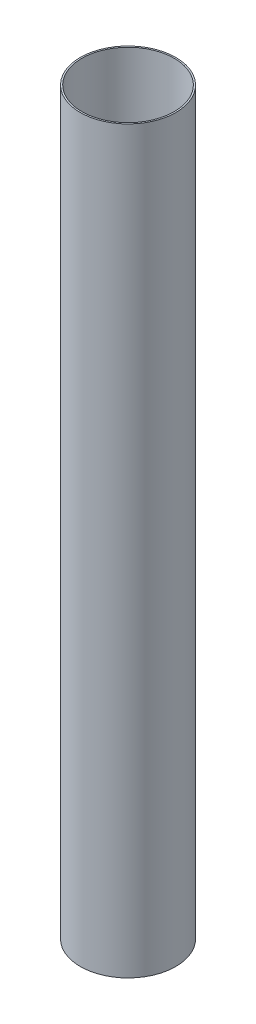
ISO-10303-21;
HEADER;
FILE_DESCRIPTION(('STEP AP214'),'2;1');
FILE_NAME('part.step','',(''),(''),'','','');
FILE_SCHEMA(('AUTOMOTIVE_DESIGN { 1 0 10303 214 1 1 1 1 }'));
ENDSEC;
DATA;
#1=APPLICATION_CONTEXT('core data for automotive mechanical design processes');
#2=APPLICATION_PROTOCOL_DEFINITION('international standard','automotive_design',2000,#1);
#3=PRODUCT_CONTEXT('',#1,'mechanical');
#4=PRODUCT('Part','Part','',(#3));
#5=PRODUCT_RELATED_PRODUCT_CATEGORY('part','',(#4));
#6=PRODUCT_DEFINITION_FORMATION('','',#4);
#7=PRODUCT_DEFINITION_CONTEXT('part definition',#1,'design');
#8=PRODUCT_DEFINITION('design','',#6,#7);
#9=PRODUCT_DEFINITION_SHAPE('','',#8);
#10=(LENGTH_UNIT() NAMED_UNIT(*) SI_UNIT(.MILLI.,.METRE.));
#11=(NAMED_UNIT(*) PLANE_ANGLE_UNIT() SI_UNIT($,.RADIAN.));
#12=(NAMED_UNIT(*) SI_UNIT($,.STERADIAN.) SOLID_ANGLE_UNIT());
#13=UNCERTAINTY_MEASURE_WITH_UNIT(LENGTH_MEASURE(1.E-05),#10,'distance_accuracy_value','');
#14=(GEOMETRIC_REPRESENTATION_CONTEXT(3) GLOBAL_UNCERTAINTY_ASSIGNED_CONTEXT((#13)) GLOBAL_UNIT_ASSIGNED_CONTEXT((#10,
#11,#12)) REPRESENTATION_CONTEXT('',''));
#15=CARTESIAN_POINT('',(0.,0.,0.));
#16=DIRECTION('',(0.,0.,1.));
#17=DIRECTION('',(1.,0.,0.));
#18=AXIS2_PLACEMENT_3D('',#15,#16,#17);
#19=CARTESIAN_POINT('',(0.,609.6,0.));
#20=DIRECTION('',(0.,1.,0.));
#21=DIRECTION('',(0.,0.,1.));
#22=AXIS2_PLACEMENT_3D('',#19,#20,#21);
#23=PLANE('',#22);
#24=CARTESIAN_POINT('',(0.,609.6,0.));
#25=DIRECTION('',(0.,1.,0.));
#26=DIRECTION('',(0.,0.,1.));
#27=AXIS2_PLACEMENT_3D('',#24,#25,#26);
#28=CIRCLE('',#27,39.37);
#29=CARTESIAN_POINT('',(0.,609.6,-39.37));
#30=VERTEX_POINT('',#29);
#31=EDGE_CURVE('E10',#30,#30,#28,.T.);
#32=ORIENTED_EDGE('',*,*,#31,.T.);
#33=EDGE_LOOP('',(#32));
#34=FACE_BOUND('',#33,.T.);
#35=CARTESIAN_POINT('',(0.,609.6,0.));
#36=DIRECTION('',(0.,1.,0.));
#37=DIRECTION('',(0.,0.,1.));
#38=AXIS2_PLACEMENT_3D('',#35,#36,#37);
#39=CIRCLE('',#38,38.1);
#40=CARTESIAN_POINT('',(0.,609.6,-38.1));
#41=VERTEX_POINT('',#40);
#42=EDGE_CURVE('E50',#41,#41,#39,.T.);
#43=ORIENTED_EDGE('',*,*,#42,.F.);
#44=EDGE_LOOP('',(#43));
#45=FACE_BOUND('',#44,.T.);
#46=ADVANCED_FACE('F39',(#34,#45),#23,.T.);
#47=CARTESIAN_POINT('',(0.,0.,0.));
#48=DIRECTION('',(0.,1.,0.));
#49=DIRECTION('',(0.,0.,1.));
#50=AXIS2_PLACEMENT_3D('',#47,#48,#49);
#51=PLANE('',#50);
#52=CARTESIAN_POINT('',(0.,0.,0.));
#53=DIRECTION('',(0.,1.,0.));
#54=DIRECTION('',(0.,0.,1.));
#55=AXIS2_PLACEMENT_3D('',#52,#53,#54);
#56=CIRCLE('',#55,39.37);
#57=CARTESIAN_POINT('',(0.,0.,-39.37));
#58=VERTEX_POINT('',#57);
#59=EDGE_CURVE('E43',#58,#58,#56,.T.);
#60=ORIENTED_EDGE('',*,*,#59,.F.);
#61=EDGE_LOOP('',(#60));
#62=FACE_BOUND('',#61,.T.);
#63=CARTESIAN_POINT('',(0.,0.,0.));
#64=DIRECTION('',(0.,1.,0.));
#65=DIRECTION('',(0.,0.,1.));
#66=AXIS2_PLACEMENT_3D('',#63,#64,#65);
#67=CIRCLE('',#66,38.1);
#68=CARTESIAN_POINT('',(0.,0.,-38.1));
#69=VERTEX_POINT('',#68);
#70=EDGE_CURVE('E52',#69,#69,#67,.T.);
#71=ORIENTED_EDGE('',*,*,#70,.T.);
#72=EDGE_LOOP('',(#71));
#73=FACE_BOUND('',#72,.T.);
#74=ADVANCED_FACE('F62',(#62,#73),#51,.F.);
#75=CARTESIAN_POINT('',(0.,609.6,0.));
#76=DIRECTION('',(0.,-1.,0.));
#77=DIRECTION('',(0.,0.,-1.));
#78=AXIS2_PLACEMENT_3D('',#75,#76,#77);
#79=CYLINDRICAL_SURFACE('',#78,39.37);
#80=CARTESIAN_POINT('',(0.,609.6,-39.37));
#81=CARTESIAN_POINT('',(0.,603.25,-39.37));
#82=CARTESIAN_POINT('',(0.,596.9,-39.37));
#83=CARTESIAN_POINT('',(0.,584.2,-39.37));
#84=CARTESIAN_POINT('',(0.,577.85,-39.37));
#85=CARTESIAN_POINT('',(0.,565.15,-39.37));
#86=CARTESIAN_POINT('',(0.,558.8,-39.37));
#87=CARTESIAN_POINT('',(0.,546.1,-39.37));
#88=CARTESIAN_POINT('',(0.,539.75,-39.37));
#89=CARTESIAN_POINT('',(0.,527.05,-39.37));
#90=CARTESIAN_POINT('',(0.,520.7,-39.37));
#91=CARTESIAN_POINT('',(0.,508.,-39.37));
#92=CARTESIAN_POINT('',(0.,501.65,-39.37));
#93=CARTESIAN_POINT('',(0.,488.95,-39.37));
#94=CARTESIAN_POINT('',(0.,482.6,-39.37));
#95=CARTESIAN_POINT('',(0.,469.9,-39.37));
#96=CARTESIAN_POINT('',(0.,463.55,-39.37));
#97=CARTESIAN_POINT('',(0.,450.85,-39.37));
#98=CARTESIAN_POINT('',(0.,444.5,-39.37));
#99=CARTESIAN_POINT('',(0.,431.8,-39.37));
#100=CARTESIAN_POINT('',(0.,425.45,-39.37));
#101=CARTESIAN_POINT('',(0.,412.75,-39.37));
#102=CARTESIAN_POINT('',(0.,406.4,-39.37));
#103=CARTESIAN_POINT('',(0.,393.7,-39.37));
#104=CARTESIAN_POINT('',(0.,387.35,-39.37));
#105=CARTESIAN_POINT('',(0.,374.65,-39.37));
#106=CARTESIAN_POINT('',(0.,368.3,-39.37));
#107=CARTESIAN_POINT('',(0.,355.6,-39.37));
#108=CARTESIAN_POINT('',(0.,349.25,-39.37));
#109=CARTESIAN_POINT('',(0.,336.55,-39.37));
#110=CARTESIAN_POINT('',(0.,330.2,-39.37));
#111=CARTESIAN_POINT('',(0.,317.5,-39.37));
#112=CARTESIAN_POINT('',(0.,311.15,-39.37));
#113=CARTESIAN_POINT('',(0.,298.45,-39.37));
#114=CARTESIAN_POINT('',(0.,292.1,-39.37));
#115=CARTESIAN_POINT('',(0.,279.4,-39.37));
#116=CARTESIAN_POINT('',(0.,273.05,-39.37));
#117=CARTESIAN_POINT('',(0.,260.35,-39.37));
#118=CARTESIAN_POINT('',(0.,254.,-39.37));
#119=CARTESIAN_POINT('',(0.,241.3,-39.37));
#120=CARTESIAN_POINT('',(0.,234.95,-39.37));
#121=CARTESIAN_POINT('',(0.,222.25,-39.37));
#122=CARTESIAN_POINT('',(0.,215.9,-39.37));
#123=CARTESIAN_POINT('',(0.,203.2,-39.37));
#124=CARTESIAN_POINT('',(0.,196.85,-39.37));
#125=CARTESIAN_POINT('',(0.,184.15,-39.37));
#126=CARTESIAN_POINT('',(0.,177.8,-39.37));
#127=CARTESIAN_POINT('',(0.,165.1,-39.37));
#128=CARTESIAN_POINT('',(0.,158.75,-39.37));
#129=CARTESIAN_POINT('',(0.,146.05,-39.37));
#130=CARTESIAN_POINT('',(0.,139.7,-39.37));
#131=CARTESIAN_POINT('',(0.,127.,-39.37));
#132=CARTESIAN_POINT('',(0.,120.65,-39.37));
#133=CARTESIAN_POINT('',(0.,107.95,-39.37));
#134=CARTESIAN_POINT('',(0.,101.6,-39.37));
#135=CARTESIAN_POINT('',(0.,88.9,-39.37));
#136=CARTESIAN_POINT('',(0.,82.5500000000001,-39.37));
#137=CARTESIAN_POINT('',(0.,69.85,-39.37));
#138=CARTESIAN_POINT('',(0.,63.5,-39.37));
#139=CARTESIAN_POINT('',(0.,50.8,-39.37));
#140=CARTESIAN_POINT('',(0.,44.45,-39.37));
#141=CARTESIAN_POINT('',(0.,31.75,-39.37));
#142=CARTESIAN_POINT('',(0.,25.4,-39.37));
#143=CARTESIAN_POINT('',(0.,12.7,-39.37));
#144=CARTESIAN_POINT('',(0.,6.35000000000001,-39.37));
#145=CARTESIAN_POINT('',(0.,0.,-39.37));
#146=B_SPLINE_CURVE_WITH_KNOTS('',3,(#80,#81,#82,#83,#84,#85,#86,#87,#88,#89,#90,#91,#92,#93,
#94,#95,#96,#97,#98,#99,#100,#101,#102,#103,#104,#105,#106,#107,#108,#109,#110,#111,#112,#113,
#114,#115,#116,#117,#118,#119,#120,#121,#122,#123,#124,#125,#126,#127,#128,#129,#130,#131,#132,
#133,#134,#135,#136,#137,#138,#139,#140,#141,#142,#143,#144,#145),.UNSPECIFIED.,.F.,.F.,(4,2,2,
2,2,2,2,2,2,2,2,2,2,2,2,2,2,2,2,2,2,2,2,2,2,2,2,2,2,2,2,2,4),(0.,19.05,38.1,57.15,76.2,
95.2500000000001,114.3,133.35,152.4,171.45,190.5,209.55,228.6,247.65,266.7,285.75,304.8,323.85,
342.9,361.95,381.,400.05,419.1,438.15,457.2,476.25,495.3,514.35,533.4,552.45,571.5,590.55,
609.6),.UNSPECIFIED.);
#147=EDGE_CURVE('BSEAM41',#30,#58,#146,.T.);
#148=ORIENTED_EDGE('',*,*,#31,.F.);
#149=ORIENTED_EDGE('',*,*,#59,.T.);
#150=ORIENTED_EDGE('',*,*,#147,.T.);
#151=ORIENTED_EDGE('',*,*,#147,.F.);
#152=EDGE_LOOP('',(#148,#150,#149,#151));
#153=FACE_BOUND('',#152,.T.);
#154=ADVANCED_FACE('F41',(#153),#79,.T.);
#155=CARTESIAN_POINT('',(0.,609.6,0.));
#156=DIRECTION('',(0.,-1.,0.));
#157=DIRECTION('',(0.,0.,-1.));
#158=AXIS2_PLACEMENT_3D('',#155,#156,#157);
#159=CYLINDRICAL_SURFACE('',#158,38.1);
#160=CARTESIAN_POINT('',(0.,609.6,-38.1));
#161=CARTESIAN_POINT('',(0.,603.25,-38.1));
#162=CARTESIAN_POINT('',(0.,596.9,-38.1));
#163=CARTESIAN_POINT('',(0.,584.2,-38.1));
#164=CARTESIAN_POINT('',(0.,577.85,-38.1));
#165=CARTESIAN_POINT('',(0.,565.15,-38.1));
#166=CARTESIAN_POINT('',(0.,558.8,-38.1));
#167=CARTESIAN_POINT('',(0.,546.1,-38.1));
#168=CARTESIAN_POINT('',(0.,539.75,-38.1));
#169=CARTESIAN_POINT('',(0.,527.05,-38.1));
#170=CARTESIAN_POINT('',(0.,520.7,-38.1));
#171=CARTESIAN_POINT('',(0.,508.,-38.1));
#172=CARTESIAN_POINT('',(0.,501.65,-38.1));
#173=CARTESIAN_POINT('',(0.,488.95,-38.1));
#174=CARTESIAN_POINT('',(0.,482.6,-38.1));
#175=CARTESIAN_POINT('',(0.,469.9,-38.1));
#176=CARTESIAN_POINT('',(0.,463.55,-38.1));
#177=CARTESIAN_POINT('',(0.,450.85,-38.1));
#178=CARTESIAN_POINT('',(0.,444.5,-38.1));
#179=CARTESIAN_POINT('',(0.,431.8,-38.1));
#180=CARTESIAN_POINT('',(0.,425.45,-38.1));
#181=CARTESIAN_POINT('',(0.,412.75,-38.1));
#182=CARTESIAN_POINT('',(0.,406.4,-38.1));
#183=CARTESIAN_POINT('',(0.,393.7,-38.1));
#184=CARTESIAN_POINT('',(0.,387.35,-38.1));
#185=CARTESIAN_POINT('',(0.,374.65,-38.1));
#186=CARTESIAN_POINT('',(0.,368.3,-38.1));
#187=CARTESIAN_POINT('',(0.,355.6,-38.1));
#188=CARTESIAN_POINT('',(0.,349.25,-38.1));
#189=CARTESIAN_POINT('',(0.,336.55,-38.1));
#190=CARTESIAN_POINT('',(0.,330.2,-38.1));
#191=CARTESIAN_POINT('',(0.,317.5,-38.1));
#192=CARTESIAN_POINT('',(0.,311.15,-38.1));
#193=CARTESIAN_POINT('',(0.,298.45,-38.1));
#194=CARTESIAN_POINT('',(0.,292.1,-38.1));
#195=CARTESIAN_POINT('',(0.,279.4,-38.1));
#196=CARTESIAN_POINT('',(0.,273.05,-38.1));
#197=CARTESIAN_POINT('',(0.,260.35,-38.1));
#198=CARTESIAN_POINT('',(0.,254.,-38.1));
#199=CARTESIAN_POINT('',(0.,241.3,-38.1));
#200=CARTESIAN_POINT('',(0.,234.95,-38.1));
#201=CARTESIAN_POINT('',(0.,222.25,-38.1));
#202=CARTESIAN_POINT('',(0.,215.9,-38.1));
#203=CARTESIAN_POINT('',(0.,203.2,-38.1));
#204=CARTESIAN_POINT('',(0.,196.85,-38.1));
#205=CARTESIAN_POINT('',(0.,184.15,-38.1));
#206=CARTESIAN_POINT('',(0.,177.8,-38.1));
#207=CARTESIAN_POINT('',(0.,165.1,-38.1));
#208=CARTESIAN_POINT('',(0.,158.75,-38.1));
#209=CARTESIAN_POINT('',(0.,146.05,-38.1));
#210=CARTESIAN_POINT('',(0.,139.7,-38.1));
#211=CARTESIAN_POINT('',(0.,127.,-38.1));
#212=CARTESIAN_POINT('',(0.,120.65,-38.1));
#213=CARTESIAN_POINT('',(0.,107.95,-38.1));
#214=CARTESIAN_POINT('',(0.,101.6,-38.1));
#215=CARTESIAN_POINT('',(0.,88.9,-38.1));
#216=CARTESIAN_POINT('',(0.,82.5500000000001,-38.1));
#217=CARTESIAN_POINT('',(0.,69.85,-38.1));
#218=CARTESIAN_POINT('',(0.,63.5,-38.1));
#219=CARTESIAN_POINT('',(0.,50.8,-38.1));
#220=CARTESIAN_POINT('',(0.,44.45,-38.1));
#221=CARTESIAN_POINT('',(0.,31.75,-38.1));
#222=CARTESIAN_POINT('',(0.,25.4,-38.1));
#223=CARTESIAN_POINT('',(0.,12.7,-38.1));
#224=CARTESIAN_POINT('',(0.,6.35000000000001,-38.1));
#225=CARTESIAN_POINT('',(0.,0.,-38.1));
#226=B_SPLINE_CURVE_WITH_KNOTS('',3,(#160,#161,#162,#163,#164,#165,#166,#167,#168,#169,#170,
#171,#172,#173,#174,#175,#176,#177,#178,#179,#180,#181,#182,#183,#184,#185,#186,#187,#188,#189,
#190,#191,#192,#193,#194,#195,#196,#197,#198,#199,#200,#201,#202,#203,#204,#205,#206,#207,#208,
#209,#210,#211,#212,#213,#214,#215,#216,#217,#218,#219,#220,#221,#222,#223,#224,#225),
.UNSPECIFIED.,.F.,.F.,(4,2,2,2,2,2,2,2,2,2,2,2,2,2,2,2,2,2,2,2,2,2,2,2,2,2,2,2,2,2,2,2,4),(0.,
19.05,38.1,57.15,76.2,95.2500000000001,114.3,133.35,152.4,171.45,190.5,209.55,228.6,247.65,
266.7,285.75,304.8,323.85,342.9,361.95,381.,400.05,419.1,438.15,457.2,476.25,495.3,514.35,533.4,
552.45,571.5,590.55,609.6),.UNSPECIFIED.);
#227=EDGE_CURVE('BSEAM58',#41,#69,#226,.T.);
#228=ORIENTED_EDGE('',*,*,#42,.T.);
#229=ORIENTED_EDGE('',*,*,#70,.F.);
#230=ORIENTED_EDGE('',*,*,#227,.T.);
#231=ORIENTED_EDGE('',*,*,#227,.F.);
#232=EDGE_LOOP('',(#228,#230,#229,#231));
#233=FACE_BOUND('',#232,.T.);
#234=ADVANCED_FACE('F58',(#233),#159,.F.);
#235=CLOSED_SHELL('',(#46,#74,#154,#234));
#236=MANIFOLD_SOLID_BREP('B2',#235);
#237=ADVANCED_BREP_SHAPE_REPRESENTATION('',(#18,#236),#14);
#238=SHAPE_DEFINITION_REPRESENTATION(#9,#237);
ENDSEC;
END-ISO-10303-21;
